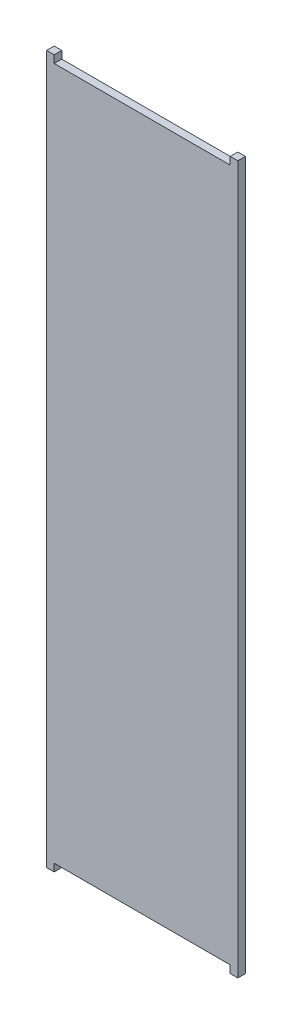
ISO-10303-21;
HEADER;
FILE_DESCRIPTION(('STEP AP214'),'2;1');
FILE_NAME('part.step','',(''),(''),'','','');
FILE_SCHEMA(('AUTOMOTIVE_DESIGN { 1 0 10303 214 1 1 1 1 }'));
ENDSEC;
DATA;
#1=APPLICATION_CONTEXT('core data for automotive mechanical design processes');
#2=APPLICATION_PROTOCOL_DEFINITION('international standard','automotive_design',2000,#1);
#3=PRODUCT_CONTEXT('',#1,'mechanical');
#4=PRODUCT('Part','Part','',(#3));
#5=PRODUCT_RELATED_PRODUCT_CATEGORY('part','',(#4));
#6=PRODUCT_DEFINITION_FORMATION('','',#4);
#7=PRODUCT_DEFINITION_CONTEXT('part definition',#1,'design');
#8=PRODUCT_DEFINITION('design','',#6,#7);
#9=PRODUCT_DEFINITION_SHAPE('','',#8);
#10=(LENGTH_UNIT() NAMED_UNIT(*) SI_UNIT(.MILLI.,.METRE.));
#11=(NAMED_UNIT(*) PLANE_ANGLE_UNIT() SI_UNIT($,.RADIAN.));
#12=(NAMED_UNIT(*) SI_UNIT($,.STERADIAN.) SOLID_ANGLE_UNIT());
#13=UNCERTAINTY_MEASURE_WITH_UNIT(LENGTH_MEASURE(1.E-05),#10,'distance_accuracy_value','');
#14=(GEOMETRIC_REPRESENTATION_CONTEXT(3) GLOBAL_UNCERTAINTY_ASSIGNED_CONTEXT((#13)) GLOBAL_UNIT_ASSIGNED_CONTEXT((#10,
#11,#12)) REPRESENTATION_CONTEXT('',''));
#15=CARTESIAN_POINT('',(0.,0.,0.));
#16=DIRECTION('',(0.,0.,1.));
#17=DIRECTION('',(1.,0.,0.));
#18=AXIS2_PLACEMENT_3D('',#15,#16,#17);
#19=CARTESIAN_POINT('',(-20.825,-77.1,1.65));
#20=DIRECTION('',(0.,1.,0.));
#21=DIRECTION('',(0.,0.,1.));
#22=AXIS2_PLACEMENT_3D('',#19,#20,#21);
#23=PLANE('',#22);
#24=DIRECTION('',(0.,0.,1.));
#25=VECTOR('',#24,1.);
#26=CARTESIAN_POINT('',(-19.175,-77.1,0.));
#27=LINE('',#26,#25);
#28=CARTESIAN_POINT('',(-19.175,-77.1,0.));
#29=VERTEX_POINT('',#28);
#30=CARTESIAN_POINT('',(-19.175,-77.1,1.65));
#31=VERTEX_POINT('',#30);
#32=EDGE_CURVE('E266',#29,#31,#27,.T.);
#33=ORIENTED_EDGE('',*,*,#32,.T.);
#34=DIRECTION('',(1.,0.,0.));
#35=VECTOR('',#34,1.);
#36=CARTESIAN_POINT('',(-20.825,-77.1,1.65));
#37=LINE('',#36,#35);
#38=CARTESIAN_POINT('',(-20.825,-77.1,1.65));
#39=VERTEX_POINT('',#38);
#40=EDGE_CURVE('E203',#39,#31,#37,.T.);
#41=ORIENTED_EDGE('',*,*,#40,.F.);
#42=DIRECTION('',(0.,0.,-1.));
#43=VECTOR('',#42,1.);
#44=CARTESIAN_POINT('',(-20.825,-77.1,1.65));
#45=LINE('',#44,#43);
#46=CARTESIAN_POINT('',(-20.825,-77.1,0.));
#47=VERTEX_POINT('',#46);
#48=EDGE_CURVE('E11',#39,#47,#45,.T.);
#49=ORIENTED_EDGE('',*,*,#48,.T.);
#50=DIRECTION('',(1.,0.,0.));
#51=VECTOR('',#50,1.);
#52=CARTESIAN_POINT('',(-20.825,-77.1,0.));
#53=LINE('',#52,#51);
#54=EDGE_CURVE('E219',#47,#29,#53,.T.);
#55=ORIENTED_EDGE('',*,*,#54,.T.);
#56=EDGE_LOOP('',(#33,#41,#49,#55));
#57=FACE_BOUND('',#56,.T.);
#58=ADVANCED_FACE('F41',(#57),#23,.F.);
#59=DIRECTION('',(0.,0.,-1.));
#60=VECTOR('',#59,1.);
#61=CARTESIAN_POINT('',(19.175,-77.1,0.));
#62=LINE('',#61,#60);
#63=CARTESIAN_POINT('',(19.175,-77.1,1.65));
#64=VERTEX_POINT('',#63);
#65=CARTESIAN_POINT('',(19.175,-77.1,0.));
#66=VERTEX_POINT('',#65);
#67=EDGE_CURVE('E263',#64,#66,#62,.T.);
#68=ORIENTED_EDGE('',*,*,#67,.T.);
#69=CARTESIAN_POINT('',(20.825,-77.1,0.));
#70=VERTEX_POINT('',#69);
#71=EDGE_CURVE('E153',#66,#70,#53,.T.);
#72=ORIENTED_EDGE('',*,*,#71,.T.);
#73=DIRECTION('',(0.,0.,-1.));
#74=VECTOR('',#73,1.);
#75=CARTESIAN_POINT('',(20.825,-77.1,1.65));
#76=LINE('',#75,#74);
#77=CARTESIAN_POINT('',(20.825,-77.1,1.65));
#78=VERTEX_POINT('',#77);
#79=EDGE_CURVE('E50',#78,#70,#76,.T.);
#80=ORIENTED_EDGE('',*,*,#79,.F.);
#81=EDGE_CURVE('E201',#64,#78,#37,.T.);
#82=ORIENTED_EDGE('',*,*,#81,.F.);
#83=EDGE_LOOP('',(#68,#72,#80,#82));
#84=FACE_BOUND('',#83,.T.);
#85=ADVANCED_FACE('F299',(#84),#23,.F.);
#86=CARTESIAN_POINT('',(0.,0.,1.65));
#87=DIRECTION('',(0.,0.,1.));
#88=DIRECTION('',(1.,0.,0.));
#89=AXIS2_PLACEMENT_3D('',#86,#87,#88);
#90=PLANE('',#89);
#91=ORIENTED_EDGE('',*,*,#40,.T.);
#92=DIRECTION('',(0.,-1.,0.));
#93=VECTOR('',#92,1.);
#94=CARTESIAN_POINT('',(-19.175,-75.45,1.65));
#95=LINE('',#94,#93);
#96=CARTESIAN_POINT('',(-19.175,-75.45,1.65));
#97=VERTEX_POINT('',#96);
#98=EDGE_CURVE('E159',#97,#31,#95,.T.);
#99=ORIENTED_EDGE('',*,*,#98,.F.);
#100=DIRECTION('',(1.,0.,0.));
#101=VECTOR('',#100,1.);
#102=CARTESIAN_POINT('',(-19.175,-75.45,1.65));
#103=LINE('',#102,#101);
#104=CARTESIAN_POINT('',(19.175,-75.45,1.65));
#105=VERTEX_POINT('',#104);
#106=EDGE_CURVE('E141',#97,#105,#103,.T.);
#107=ORIENTED_EDGE('',*,*,#106,.T.);
#108=DIRECTION('',(0.,-1.,0.));
#109=VECTOR('',#108,1.);
#110=CARTESIAN_POINT('',(19.175,-75.45,1.65));
#111=LINE('',#110,#109);
#112=EDGE_CURVE('E138',#105,#64,#111,.T.);
#113=ORIENTED_EDGE('',*,*,#112,.T.);
#114=ORIENTED_EDGE('',*,*,#81,.T.);
#115=DIRECTION('',(0.,1.,0.));
#116=VECTOR('',#115,1.);
#117=CARTESIAN_POINT('',(20.825,77.1,1.65));
#118=LINE('',#117,#116);
#119=CARTESIAN_POINT('',(20.825,77.1,1.65));
#120=VERTEX_POINT('',#119);
#121=EDGE_CURVE('E207',#78,#120,#118,.T.);
#122=ORIENTED_EDGE('',*,*,#121,.T.);
#123=DIRECTION('',(-1.,0.,0.));
#124=VECTOR('',#123,1.);
#125=CARTESIAN_POINT('',(-20.825,77.1,1.65));
#126=LINE('',#125,#124);
#127=CARTESIAN_POINT('',(19.175,77.1,1.65));
#128=VERTEX_POINT('',#127);
#129=EDGE_CURVE('E211',#120,#128,#126,.T.);
#130=ORIENTED_EDGE('',*,*,#129,.T.);
#131=DIRECTION('',(0.,1.,0.));
#132=VECTOR('',#131,1.);
#133=CARTESIAN_POINT('',(19.175,75.45,1.65));
#134=LINE('',#133,#132);
#135=CARTESIAN_POINT('',(19.175,75.45,1.65));
#136=VERTEX_POINT('',#135);
#137=EDGE_CURVE('E191',#136,#128,#134,.T.);
#138=ORIENTED_EDGE('',*,*,#137,.F.);
#139=DIRECTION('',(1.,0.,0.));
#140=VECTOR('',#139,1.);
#141=CARTESIAN_POINT('',(-19.175,75.45,1.65));
#142=LINE('',#141,#140);
#143=CARTESIAN_POINT('',(-19.175,75.45,1.65));
#144=VERTEX_POINT('',#143);
#145=EDGE_CURVE('E168',#144,#136,#142,.T.);
#146=ORIENTED_EDGE('',*,*,#145,.F.);
#147=DIRECTION('',(0.,1.,0.));
#148=VECTOR('',#147,1.);
#149=CARTESIAN_POINT('',(-19.175,75.45,1.65));
#150=LINE('',#149,#148);
#151=CARTESIAN_POINT('',(-19.175,77.1,1.65));
#152=VERTEX_POINT('',#151);
#153=EDGE_CURVE('E177',#144,#152,#150,.T.);
#154=ORIENTED_EDGE('',*,*,#153,.T.);
#155=CARTESIAN_POINT('',(-20.825,77.1,1.65));
#156=VERTEX_POINT('',#155);
#157=EDGE_CURVE('E210',#152,#156,#126,.T.);
#158=ORIENTED_EDGE('',*,*,#157,.T.);
#159=DIRECTION('',(0.,-1.,0.));
#160=VECTOR('',#159,1.);
#161=CARTESIAN_POINT('',(-20.825,77.1,1.65));
#162=LINE('',#161,#160);
#163=EDGE_CURVE('E197',#156,#39,#162,.T.);
#164=ORIENTED_EDGE('',*,*,#163,.T.);
#165=EDGE_LOOP('',(#91,#99,#107,#113,#114,#122,#130,#138,#146,#154,#158,#164));
#166=FACE_BOUND('',#165,.T.);
#167=ADVANCED_FACE('F253',(#166),#90,.T.);
#168=CARTESIAN_POINT('',(0.,0.,0.));
#169=DIRECTION('',(0.,0.,1.));
#170=DIRECTION('',(1.,0.,0.));
#171=AXIS2_PLACEMENT_3D('',#168,#169,#170);
#172=PLANE('',#171);
#173=DIRECTION('',(0.,-1.,0.));
#174=VECTOR('',#173,1.);
#175=CARTESIAN_POINT('',(-19.175,-75.45,0.));
#176=LINE('',#175,#174);
#177=CARTESIAN_POINT('',(-19.175,-75.45,0.));
#178=VERTEX_POINT('',#177);
#179=EDGE_CURVE('E155',#178,#29,#176,.T.);
#180=ORIENTED_EDGE('',*,*,#179,.T.);
#181=ORIENTED_EDGE('',*,*,#54,.F.);
#182=DIRECTION('',(0.,-1.,0.));
#183=VECTOR('',#182,1.);
#184=CARTESIAN_POINT('',(-20.825,77.1,0.));
#185=LINE('',#184,#183);
#186=CARTESIAN_POINT('',(-20.825,77.1,0.));
#187=VERTEX_POINT('',#186);
#188=EDGE_CURVE('E186',#187,#47,#185,.T.);
#189=ORIENTED_EDGE('',*,*,#188,.F.);
#190=DIRECTION('',(-1.,0.,0.));
#191=VECTOR('',#190,1.);
#192=CARTESIAN_POINT('',(-20.825,77.1,0.));
#193=LINE('',#192,#191);
#194=CARTESIAN_POINT('',(-19.175,77.1,0.));
#195=VERTEX_POINT('',#194);
#196=EDGE_CURVE('E226',#195,#187,#193,.T.);
#197=ORIENTED_EDGE('',*,*,#196,.F.);
#198=DIRECTION('',(0.,1.,0.));
#199=VECTOR('',#198,1.);
#200=CARTESIAN_POINT('',(-19.175,75.45,0.));
#201=LINE('',#200,#199);
#202=CARTESIAN_POINT('',(-19.175,75.45,0.));
#203=VERTEX_POINT('',#202);
#204=EDGE_CURVE('E183',#203,#195,#201,.T.);
#205=ORIENTED_EDGE('',*,*,#204,.F.);
#206=DIRECTION('',(-1.,0.,0.));
#207=VECTOR('',#206,1.);
#208=CARTESIAN_POINT('',(-19.175,75.45,0.));
#209=LINE('',#208,#207);
#210=CARTESIAN_POINT('',(19.175,75.45,0.));
#211=VERTEX_POINT('',#210);
#212=EDGE_CURVE('E174',#211,#203,#209,.T.);
#213=ORIENTED_EDGE('',*,*,#212,.F.);
#214=DIRECTION('',(0.,1.,0.));
#215=VECTOR('',#214,1.);
#216=CARTESIAN_POINT('',(19.175,75.45,0.));
#217=LINE('',#216,#215);
#218=CARTESIAN_POINT('',(19.175,77.1,0.));
#219=VERTEX_POINT('',#218);
#220=EDGE_CURVE('E187',#211,#219,#217,.T.);
#221=ORIENTED_EDGE('',*,*,#220,.T.);
#222=CARTESIAN_POINT('',(20.825,77.1,0.));
#223=VERTEX_POINT('',#222);
#224=EDGE_CURVE('E202',#223,#219,#193,.T.);
#225=ORIENTED_EDGE('',*,*,#224,.F.);
#226=DIRECTION('',(0.,1.,0.));
#227=VECTOR('',#226,1.);
#228=CARTESIAN_POINT('',(20.825,77.1,0.));
#229=LINE('',#228,#227);
#230=EDGE_CURVE('E223',#70,#223,#229,.T.);
#231=ORIENTED_EDGE('',*,*,#230,.F.);
#232=ORIENTED_EDGE('',*,*,#71,.F.);
#233=DIRECTION('',(0.,-1.,0.));
#234=VECTOR('',#233,1.);
#235=CARTESIAN_POINT('',(19.175,-75.45,0.));
#236=LINE('',#235,#234);
#237=CARTESIAN_POINT('',(19.175,-75.45,0.));
#238=VERTEX_POINT('',#237);
#239=EDGE_CURVE('E135',#238,#66,#236,.T.);
#240=ORIENTED_EDGE('',*,*,#239,.F.);
#241=DIRECTION('',(-1.,0.,0.));
#242=VECTOR('',#241,1.);
#243=CARTESIAN_POINT('',(-19.175,-75.45,0.));
#244=LINE('',#243,#242);
#245=EDGE_CURVE('E142',#238,#178,#244,.T.);
#246=ORIENTED_EDGE('',*,*,#245,.T.);
#247=EDGE_LOOP('',(#180,#181,#189,#197,#205,#213,#221,#225,#231,#232,#240,#246));
#248=FACE_BOUND('',#247,.T.);
#249=ADVANCED_FACE('F151',(#248),#172,.F.);
#250=CARTESIAN_POINT('',(-20.825,77.1,1.65));
#251=DIRECTION('',(0.,-1.,0.));
#252=DIRECTION('',(0.,0.,-1.));
#253=AXIS2_PLACEMENT_3D('',#250,#251,#252);
#254=PLANE('',#253);
#255=ORIENTED_EDGE('',*,*,#157,.F.);
#256=DIRECTION('',(0.,0.,1.));
#257=VECTOR('',#256,1.);
#258=CARTESIAN_POINT('',(-19.175,77.1,0.));
#259=LINE('',#258,#257);
#260=EDGE_CURVE('E178',#195,#152,#259,.T.);
#261=ORIENTED_EDGE('',*,*,#260,.F.);
#262=ORIENTED_EDGE('',*,*,#196,.T.);
#263=DIRECTION('',(0.,0.,-1.));
#264=VECTOR('',#263,1.);
#265=CARTESIAN_POINT('',(-20.825,77.1,1.65));
#266=LINE('',#265,#264);
#267=EDGE_CURVE('E215',#156,#187,#266,.T.);
#268=ORIENTED_EDGE('',*,*,#267,.F.);
#269=EDGE_LOOP('',(#255,#261,#262,#268));
#270=FACE_BOUND('',#269,.T.);
#271=ADVANCED_FACE('F283',(#270),#254,.F.);
#272=CARTESIAN_POINT('',(-20.825,77.1,1.65));
#273=DIRECTION('',(1.,0.,0.));
#274=DIRECTION('',(0.,0.,-1.));
#275=AXIS2_PLACEMENT_3D('',#272,#273,#274);
#276=PLANE('',#275);
#277=ORIENTED_EDGE('',*,*,#188,.T.);
#278=ORIENTED_EDGE('',*,*,#48,.F.);
#279=ORIENTED_EDGE('',*,*,#163,.F.);
#280=ORIENTED_EDGE('',*,*,#267,.T.);
#281=EDGE_LOOP('',(#277,#278,#279,#280));
#282=FACE_BOUND('',#281,.T.);
#283=ADVANCED_FACE('F43',(#282),#276,.F.);
#284=CARTESIAN_POINT('',(20.825,77.1,1.65));
#285=DIRECTION('',(-1.,0.,0.));
#286=DIRECTION('',(0.,0.,1.));
#287=AXIS2_PLACEMENT_3D('',#284,#285,#286);
#288=PLANE('',#287);
#289=ORIENTED_EDGE('',*,*,#230,.T.);
#290=DIRECTION('',(0.,0.,-1.));
#291=VECTOR('',#290,1.);
#292=CARTESIAN_POINT('',(20.825,77.1,1.65));
#293=LINE('',#292,#291);
#294=EDGE_CURVE('E233',#120,#223,#293,.T.);
#295=ORIENTED_EDGE('',*,*,#294,.F.);
#296=ORIENTED_EDGE('',*,*,#121,.F.);
#297=ORIENTED_EDGE('',*,*,#79,.T.);
#298=EDGE_LOOP('',(#289,#295,#296,#297));
#299=FACE_BOUND('',#298,.T.);
#300=ADVANCED_FACE('F241',(#299),#288,.F.);
#301=ORIENTED_EDGE('',*,*,#224,.T.);
#302=DIRECTION('',(0.,0.,-1.));
#303=VECTOR('',#302,1.);
#304=CARTESIAN_POINT('',(19.175,77.1,0.));
#305=LINE('',#304,#303);
#306=EDGE_CURVE('E169',#128,#219,#305,.T.);
#307=ORIENTED_EDGE('',*,*,#306,.F.);
#308=ORIENTED_EDGE('',*,*,#129,.F.);
#309=ORIENTED_EDGE('',*,*,#294,.T.);
#310=EDGE_LOOP('',(#301,#307,#308,#309));
#311=FACE_BOUND('',#310,.T.);
#312=ADVANCED_FACE('F249',(#311),#254,.F.);
#313=CARTESIAN_POINT('',(-19.175,75.45,0.));
#314=DIRECTION('',(-1.,0.,0.));
#315=DIRECTION('',(0.,0.,1.));
#316=AXIS2_PLACEMENT_3D('',#313,#314,#315);
#317=PLANE('',#316);
#318=ORIENTED_EDGE('',*,*,#260,.T.);
#319=ORIENTED_EDGE('',*,*,#153,.F.);
#320=DIRECTION('',(0.,0.,1.));
#321=VECTOR('',#320,1.);
#322=CARTESIAN_POINT('',(-19.175,75.45,0.));
#323=LINE('',#322,#321);
#324=EDGE_CURVE('E164',#203,#144,#323,.T.);
#325=ORIENTED_EDGE('',*,*,#324,.F.);
#326=ORIENTED_EDGE('',*,*,#204,.T.);
#327=EDGE_LOOP('',(#318,#319,#325,#326));
#328=FACE_BOUND('',#327,.T.);
#329=ADVANCED_FACE('F286',(#328),#317,.F.);
#330=CARTESIAN_POINT('',(19.175,75.45,0.));
#331=DIRECTION('',(1.,0.,0.));
#332=DIRECTION('',(0.,0.,-1.));
#333=AXIS2_PLACEMENT_3D('',#330,#331,#332);
#334=PLANE('',#333);
#335=ORIENTED_EDGE('',*,*,#306,.T.);
#336=ORIENTED_EDGE('',*,*,#220,.F.);
#337=DIRECTION('',(0.,0.,-1.));
#338=VECTOR('',#337,1.);
#339=CARTESIAN_POINT('',(19.175,75.45,0.));
#340=LINE('',#339,#338);
#341=EDGE_CURVE('E65',#136,#211,#340,.T.);
#342=ORIENTED_EDGE('',*,*,#341,.F.);
#343=ORIENTED_EDGE('',*,*,#137,.T.);
#344=EDGE_LOOP('',(#335,#336,#342,#343));
#345=FACE_BOUND('',#344,.T.);
#346=ADVANCED_FACE('F289',(#345),#334,.F.);
#347=CARTESIAN_POINT('',(0.,75.45,0.));
#348=DIRECTION('',(0.,1.,0.));
#349=DIRECTION('',(0.,0.,1.));
#350=AXIS2_PLACEMENT_3D('',#347,#348,#349);
#351=PLANE('',#350);
#352=ORIENTED_EDGE('',*,*,#324,.T.);
#353=ORIENTED_EDGE('',*,*,#145,.T.);
#354=ORIENTED_EDGE('',*,*,#341,.T.);
#355=ORIENTED_EDGE('',*,*,#212,.T.);
#356=EDGE_LOOP('',(#352,#353,#354,#355));
#357=FACE_BOUND('',#356,.T.);
#358=ADVANCED_FACE('F287',(#357),#351,.T.);
#359=CARTESIAN_POINT('',(-19.175,-75.45,0.));
#360=DIRECTION('',(1.,0.,0.));
#361=DIRECTION('',(0.,0.,-1.));
#362=AXIS2_PLACEMENT_3D('',#359,#360,#361);
#363=PLANE('',#362);
#364=ORIENTED_EDGE('',*,*,#32,.F.);
#365=ORIENTED_EDGE('',*,*,#179,.F.);
#366=DIRECTION('',(0.,0.,1.));
#367=VECTOR('',#366,1.);
#368=CARTESIAN_POINT('',(-19.175,-75.45,0.));
#369=LINE('',#368,#367);
#370=EDGE_CURVE('E57',#178,#97,#369,.T.);
#371=ORIENTED_EDGE('',*,*,#370,.T.);
#372=ORIENTED_EDGE('',*,*,#98,.T.);
#373=EDGE_LOOP('',(#364,#365,#371,#372));
#374=FACE_BOUND('',#373,.T.);
#375=ADVANCED_FACE('F272',(#374),#363,.T.);
#376=CARTESIAN_POINT('',(19.175,-75.45,0.));
#377=DIRECTION('',(-1.,0.,0.));
#378=DIRECTION('',(0.,0.,1.));
#379=AXIS2_PLACEMENT_3D('',#376,#377,#378);
#380=PLANE('',#379);
#381=ORIENTED_EDGE('',*,*,#67,.F.);
#382=ORIENTED_EDGE('',*,*,#112,.F.);
#383=DIRECTION('',(0.,0.,-1.));
#384=VECTOR('',#383,1.);
#385=CARTESIAN_POINT('',(19.175,-75.45,0.));
#386=LINE('',#385,#384);
#387=EDGE_CURVE('E132',#105,#238,#386,.T.);
#388=ORIENTED_EDGE('',*,*,#387,.T.);
#389=ORIENTED_EDGE('',*,*,#239,.T.);
#390=EDGE_LOOP('',(#381,#382,#388,#389));
#391=FACE_BOUND('',#390,.T.);
#392=ADVANCED_FACE('F133',(#391),#380,.T.);
#393=CARTESIAN_POINT('',(0.,-75.45,0.));
#394=DIRECTION('',(0.,-1.,0.));
#395=DIRECTION('',(0.,0.,1.));
#396=AXIS2_PLACEMENT_3D('',#393,#394,#395);
#397=PLANE('',#396);
#398=ORIENTED_EDGE('',*,*,#370,.F.);
#399=ORIENTED_EDGE('',*,*,#245,.F.);
#400=ORIENTED_EDGE('',*,*,#387,.F.);
#401=ORIENTED_EDGE('',*,*,#106,.F.);
#402=EDGE_LOOP('',(#398,#399,#400,#401));
#403=FACE_BOUND('',#402,.T.);
#404=ADVANCED_FACE('F145',(#403),#397,.T.);
#405=CLOSED_SHELL('',(#58,#85,#167,#249,#271,#283,#300,#312,#329,#346,#358,#375,#392,#404));
#406=MANIFOLD_SOLID_BREP('B2',#405);
#407=ADVANCED_BREP_SHAPE_REPRESENTATION('',(#18,#406),#14);
#408=SHAPE_DEFINITION_REPRESENTATION(#9,#407);
ENDSEC;
END-ISO-10303-21;
